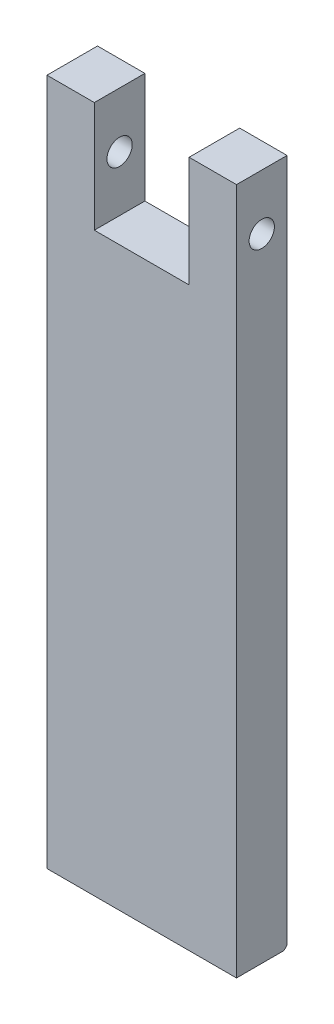
ISO-10303-21;
HEADER;
FILE_DESCRIPTION(('STEP AP214'),'2;1');
FILE_NAME('part.step','',(''),(''),'','','');
FILE_SCHEMA(('AUTOMOTIVE_DESIGN { 1 0 10303 214 1 1 1 1 }'));
ENDSEC;
DATA;
#1=APPLICATION_CONTEXT('core data for automotive mechanical design processes');
#2=APPLICATION_PROTOCOL_DEFINITION('international standard','automotive_design',2000,#1);
#3=PRODUCT_CONTEXT('',#1,'mechanical');
#4=PRODUCT('Part','Part','',(#3));
#5=PRODUCT_RELATED_PRODUCT_CATEGORY('part','',(#4));
#6=PRODUCT_DEFINITION_FORMATION('','',#4);
#7=PRODUCT_DEFINITION_CONTEXT('part definition',#1,'design');
#8=PRODUCT_DEFINITION('design','',#6,#7);
#9=PRODUCT_DEFINITION_SHAPE('','',#8);
#10=(LENGTH_UNIT() NAMED_UNIT(*) SI_UNIT(.MILLI.,.METRE.));
#11=(NAMED_UNIT(*) PLANE_ANGLE_UNIT() SI_UNIT($,.RADIAN.));
#12=(NAMED_UNIT(*) SI_UNIT($,.STERADIAN.) SOLID_ANGLE_UNIT());
#13=UNCERTAINTY_MEASURE_WITH_UNIT(LENGTH_MEASURE(1.E-05),#10,'distance_accuracy_value','');
#14=(GEOMETRIC_REPRESENTATION_CONTEXT(3) GLOBAL_UNCERTAINTY_ASSIGNED_CONTEXT((#13)) GLOBAL_UNIT_ASSIGNED_CONTEXT((#10,
#11,#12)) REPRESENTATION_CONTEXT('',''));
#15=CARTESIAN_POINT('',(0.,0.,0.));
#16=DIRECTION('',(0.,0.,1.));
#17=DIRECTION('',(1.,0.,0.));
#18=AXIS2_PLACEMENT_3D('',#15,#16,#17);
#19=CARTESIAN_POINT('',(0.,0.,16.));
#20=DIRECTION('',(1.,0.,0.));
#21=DIRECTION('',(0.,0.,-1.));
#22=AXIS2_PLACEMENT_3D('',#19,#20,#21);
#23=PLANE('',#22);
#24=CARTESIAN_POINT('',(0.,200.,8.));
#25=DIRECTION('',(-1.,0.,0.));
#26=DIRECTION('',(0.,0.,1.));
#27=AXIS2_PLACEMENT_3D('',#24,#25,#26);
#28=CIRCLE('',#27,4.);
#29=CARTESIAN_POINT('',(0.,200.,12.));
#30=VERTEX_POINT('',#29);
#31=EDGE_CURVE('E232',#30,#30,#28,.T.);
#32=ORIENTED_EDGE('',*,*,#31,.F.);
#33=EDGE_LOOP('',(#32));
#34=FACE_BOUND('',#33,.T.);
#35=DIRECTION('',(0.,-1.,0.));
#36=VECTOR('',#35,1.);
#37=CARTESIAN_POINT('',(0.,0.,16.));
#38=LINE('',#37,#36);
#39=CARTESIAN_POINT('',(0.,217.5,16.));
#40=VERTEX_POINT('',#39);
#41=CARTESIAN_POINT('',(0.,0.,16.));
#42=VERTEX_POINT('',#41);
#43=EDGE_CURVE('E137',#40,#42,#38,.T.);
#44=ORIENTED_EDGE('',*,*,#43,.F.);
#45=DIRECTION('',(0.,0.,-1.));
#46=VECTOR('',#45,1.);
#47=CARTESIAN_POINT('',(0.,217.5,16.));
#48=LINE('',#47,#46);
#49=CARTESIAN_POINT('',(0.,217.5,0.));
#50=VERTEX_POINT('',#49);
#51=EDGE_CURVE('E127',#40,#50,#48,.T.);
#52=ORIENTED_EDGE('',*,*,#51,.T.);
#53=DIRECTION('',(0.,-1.,0.));
#54=VECTOR('',#53,1.);
#55=CARTESIAN_POINT('',(0.,0.,0.));
#56=LINE('',#55,#54);
#57=CARTESIAN_POINT('',(0.,1.,0.));
#58=VERTEX_POINT('',#57);
#59=EDGE_CURVE('E141',#50,#58,#56,.T.);
#60=ORIENTED_EDGE('',*,*,#59,.T.);
#61=DIRECTION('',(0.,-0.707106781186548,0.707106781186548));
#62=VECTOR('',#61,1.);
#63=CARTESIAN_POINT('',(0.,0.,1.));
#64=LINE('',#63,#62);
#65=CARTESIAN_POINT('',(0.,0.,1.));
#66=VERTEX_POINT('',#65);
#67=EDGE_CURVE('E12',#58,#66,#64,.T.);
#68=ORIENTED_EDGE('',*,*,#67,.T.);
#69=DIRECTION('',(0.,0.,-1.));
#70=VECTOR('',#69,1.);
#71=CARTESIAN_POINT('',(0.,0.,16.));
#72=LINE('',#71,#70);
#73=EDGE_CURVE('E135',#42,#66,#72,.T.);
#74=ORIENTED_EDGE('',*,*,#73,.F.);
#75=EDGE_LOOP('',(#44,#52,#60,#68,#74));
#76=FACE_BOUND('',#75,.T.);
#77=ADVANCED_FACE('F35',(#34,#76),#23,.F.);
#78=CARTESIAN_POINT('',(0.,0.,16.));
#79=DIRECTION('',(0.,1.,0.));
#80=DIRECTION('',(0.,0.,1.));
#81=AXIS2_PLACEMENT_3D('',#78,#79,#80);
#82=PLANE('',#81);
#83=CARTESIAN_POINT('',(41.5,0.,8.5));
#84=DIRECTION('',(0.,-1.,0.));
#85=DIRECTION('',(0.,0.,-1.));
#86=AXIS2_PLACEMENT_3D('',#83,#84,#85);
#87=CIRCLE('',#86,2.);
#88=CARTESIAN_POINT('',(41.5,0.,6.5));
#89=VERTEX_POINT('',#88);
#90=EDGE_CURVE('E264',#89,#89,#87,.T.);
#91=ORIENTED_EDGE('',*,*,#90,.F.);
#92=EDGE_LOOP('',(#91));
#93=FACE_BOUND('',#92,.T.);
#94=CARTESIAN_POINT('',(18.5,0.,8.5));
#95=DIRECTION('',(0.,-1.,0.));
#96=DIRECTION('',(0.,0.,-1.));
#97=AXIS2_PLACEMENT_3D('',#94,#95,#96);
#98=CIRCLE('',#97,2.);
#99=CARTESIAN_POINT('',(18.5,0.,6.5));
#100=VERTEX_POINT('',#99);
#101=EDGE_CURVE('E267',#100,#100,#98,.T.);
#102=ORIENTED_EDGE('',*,*,#101,.F.);
#103=EDGE_LOOP('',(#102));
#104=FACE_BOUND('',#103,.T.);
#105=ORIENTED_EDGE('',*,*,#73,.T.);
#106=DIRECTION('',(1.,0.,0.));
#107=VECTOR('',#106,1.);
#108=CARTESIAN_POINT('',(60.,0.,1.));
#109=LINE('',#108,#107);
#110=CARTESIAN_POINT('',(60.,0.,1.));
#111=VERTEX_POINT('',#110);
#112=EDGE_CURVE('E147',#66,#111,#109,.T.);
#113=ORIENTED_EDGE('',*,*,#112,.T.);
#114=DIRECTION('',(0.,0.,-1.));
#115=VECTOR('',#114,1.);
#116=CARTESIAN_POINT('',(60.,0.,16.));
#117=LINE('',#116,#115);
#118=CARTESIAN_POINT('',(60.,0.,16.));
#119=VERTEX_POINT('',#118);
#120=EDGE_CURVE('E133',#119,#111,#117,.T.);
#121=ORIENTED_EDGE('',*,*,#120,.F.);
#122=DIRECTION('',(1.,0.,0.));
#123=VECTOR('',#122,1.);
#124=CARTESIAN_POINT('',(0.,0.,16.));
#125=LINE('',#124,#123);
#126=EDGE_CURVE('E131',#42,#119,#125,.T.);
#127=ORIENTED_EDGE('',*,*,#126,.F.);
#128=EDGE_LOOP('',(#105,#113,#121,#127));
#129=FACE_BOUND('',#128,.T.);
#130=ADVANCED_FACE('F166',(#93,#104,#129),#82,.F.);
#131=CARTESIAN_POINT('',(60.,0.,16.));
#132=DIRECTION('',(-1.,0.,0.));
#133=DIRECTION('',(0.,0.,1.));
#134=AXIS2_PLACEMENT_3D('',#131,#132,#133);
#135=PLANE('',#134);
#136=CARTESIAN_POINT('',(60.,200.,8.));
#137=DIRECTION('',(-1.,0.,0.));
#138=DIRECTION('',(0.,0.,1.));
#139=AXIS2_PLACEMENT_3D('',#136,#137,#138);
#140=CIRCLE('',#139,4.);
#141=CARTESIAN_POINT('',(60.,200.,12.));
#142=VERTEX_POINT('',#141);
#143=EDGE_CURVE('E235',#142,#142,#140,.T.);
#144=ORIENTED_EDGE('',*,*,#143,.T.);
#145=EDGE_LOOP('',(#144));
#146=FACE_BOUND('',#145,.T.);
#147=DIRECTION('',(0.,1.,0.));
#148=VECTOR('',#147,1.);
#149=CARTESIAN_POINT('',(60.,0.,0.));
#150=LINE('',#149,#148);
#151=CARTESIAN_POINT('',(60.,1.,0.));
#152=VERTEX_POINT('',#151);
#153=CARTESIAN_POINT('',(60.,217.5,0.));
#154=VERTEX_POINT('',#153);
#155=EDGE_CURVE('E126',#152,#154,#150,.T.);
#156=ORIENTED_EDGE('',*,*,#155,.T.);
#157=DIRECTION('',(0.,0.,-1.));
#158=VECTOR('',#157,1.);
#159=CARTESIAN_POINT('',(60.,217.5,16.));
#160=LINE('',#159,#158);
#161=CARTESIAN_POINT('',(60.,217.5,16.));
#162=VERTEX_POINT('',#161);
#163=EDGE_CURVE('E110',#162,#154,#160,.T.);
#164=ORIENTED_EDGE('',*,*,#163,.F.);
#165=DIRECTION('',(0.,1.,0.));
#166=VECTOR('',#165,1.);
#167=CARTESIAN_POINT('',(60.,0.,16.));
#168=LINE('',#167,#166);
#169=EDGE_CURVE('E124',#119,#162,#168,.T.);
#170=ORIENTED_EDGE('',*,*,#169,.F.);
#171=ORIENTED_EDGE('',*,*,#120,.T.);
#172=DIRECTION('',(0.,0.707106781186548,-0.707106781186548));
#173=VECTOR('',#172,1.);
#174=CARTESIAN_POINT('',(60.,0.,1.));
#175=LINE('',#174,#173);
#176=EDGE_CURVE('E150',#111,#152,#175,.T.);
#177=ORIENTED_EDGE('',*,*,#176,.T.);
#178=EDGE_LOOP('',(#156,#164,#170,#171,#177));
#179=FACE_BOUND('',#178,.T.);
#180=ADVANCED_FACE('F122',(#146,#179),#135,.F.);
#181=CARTESIAN_POINT('',(0.,0.,16.));
#182=DIRECTION('',(0.,0.,-1.));
#183=DIRECTION('',(-1.,0.,0.));
#184=AXIS2_PLACEMENT_3D('',#181,#182,#183);
#185=PLANE('',#184);
#186=ORIENTED_EDGE('',*,*,#169,.T.);
#187=DIRECTION('',(-1.,0.,0.));
#188=VECTOR('',#187,1.);
#189=CARTESIAN_POINT('',(0.,217.5,16.));
#190=LINE('',#189,#188);
#191=CARTESIAN_POINT('',(45.,217.5,16.));
#192=VERTEX_POINT('',#191);
#193=EDGE_CURVE('E107',#162,#192,#190,.T.);
#194=ORIENTED_EDGE('',*,*,#193,.T.);
#195=DIRECTION('',(0.,1.,0.));
#196=VECTOR('',#195,1.);
#197=CARTESIAN_POINT('',(45.,182.5,16.));
#198=LINE('',#197,#196);
#199=CARTESIAN_POINT('',(45.,182.5,16.));
#200=VERTEX_POINT('',#199);
#201=EDGE_CURVE('E244',#200,#192,#198,.T.);
#202=ORIENTED_EDGE('',*,*,#201,.F.);
#203=DIRECTION('',(1.,0.,0.));
#204=VECTOR('',#203,1.);
#205=CARTESIAN_POINT('',(15.,182.5,16.));
#206=LINE('',#205,#204);
#207=CARTESIAN_POINT('',(15.,182.5,16.));
#208=VERTEX_POINT('',#207);
#209=EDGE_CURVE('E254',#208,#200,#206,.T.);
#210=ORIENTED_EDGE('',*,*,#209,.F.);
#211=DIRECTION('',(0.,-1.,0.));
#212=VECTOR('',#211,1.);
#213=CARTESIAN_POINT('',(15.,182.5,16.));
#214=LINE('',#213,#212);
#215=CARTESIAN_POINT('',(15.,217.5,16.));
#216=VERTEX_POINT('',#215);
#217=EDGE_CURVE('E51',#216,#208,#214,.T.);
#218=ORIENTED_EDGE('',*,*,#217,.F.);
#219=EDGE_CURVE('E117',#216,#40,#190,.T.);
#220=ORIENTED_EDGE('',*,*,#219,.T.);
#221=ORIENTED_EDGE('',*,*,#43,.T.);
#222=ORIENTED_EDGE('',*,*,#126,.T.);
#223=EDGE_LOOP('',(#186,#194,#202,#210,#218,#220,#221,#222));
#224=FACE_BOUND('',#223,.T.);
#225=ADVANCED_FACE('F129',(#224),#185,.F.);
#226=CARTESIAN_POINT('',(0.,0.,0.));
#227=DIRECTION('',(0.,0.,-1.));
#228=DIRECTION('',(-1.,0.,0.));
#229=AXIS2_PLACEMENT_3D('',#226,#227,#228);
#230=PLANE('',#229);
#231=DIRECTION('',(-1.,0.,0.));
#232=VECTOR('',#231,1.);
#233=CARTESIAN_POINT('',(0.,217.5,0.));
#234=LINE('',#233,#232);
#235=CARTESIAN_POINT('',(45.,217.5,0.));
#236=VERTEX_POINT('',#235);
#237=EDGE_CURVE('E230',#154,#236,#234,.T.);
#238=ORIENTED_EDGE('',*,*,#237,.F.);
#239=ORIENTED_EDGE('',*,*,#155,.F.);
#240=DIRECTION('',(-1.,0.,0.));
#241=VECTOR('',#240,1.);
#242=CARTESIAN_POINT('',(0.,1.,0.));
#243=LINE('',#242,#241);
#244=EDGE_CURVE('E44',#152,#58,#243,.T.);
#245=ORIENTED_EDGE('',*,*,#244,.T.);
#246=ORIENTED_EDGE('',*,*,#59,.F.);
#247=CARTESIAN_POINT('',(15.,217.5,0.));
#248=VERTEX_POINT('',#247);
#249=EDGE_CURVE('E225',#248,#50,#234,.T.);
#250=ORIENTED_EDGE('',*,*,#249,.F.);
#251=DIRECTION('',(0.,1.,0.));
#252=VECTOR('',#251,1.);
#253=CARTESIAN_POINT('',(15.,182.5,0.));
#254=LINE('',#253,#252);
#255=CARTESIAN_POINT('',(15.,182.5,0.));
#256=VERTEX_POINT('',#255);
#257=EDGE_CURVE('E250',#256,#248,#254,.T.);
#258=ORIENTED_EDGE('',*,*,#257,.F.);
#259=DIRECTION('',(-1.,0.,0.));
#260=VECTOR('',#259,1.);
#261=CARTESIAN_POINT('',(15.,182.5,0.));
#262=LINE('',#261,#260);
#263=CARTESIAN_POINT('',(45.,182.5,0.));
#264=VERTEX_POINT('',#263);
#265=EDGE_CURVE('E247',#264,#256,#262,.T.);
#266=ORIENTED_EDGE('',*,*,#265,.F.);
#267=DIRECTION('',(0.,-1.,0.));
#268=VECTOR('',#267,1.);
#269=CARTESIAN_POINT('',(45.,182.5,0.));
#270=LINE('',#269,#268);
#271=EDGE_CURVE('E59',#236,#264,#270,.T.);
#272=ORIENTED_EDGE('',*,*,#271,.F.);
#273=EDGE_LOOP('',(#238,#239,#245,#246,#250,#258,#266,#272));
#274=FACE_BOUND('',#273,.T.);
#275=ADVANCED_FACE('F157',(#274),#230,.T.);
#276=CARTESIAN_POINT('',(0.,0.,1.));
#277=DIRECTION('',(0.,-0.707106781186547,-0.707106781186547));
#278=DIRECTION('',(-1.,0.,0.));
#279=AXIS2_PLACEMENT_3D('',#276,#277,#278);
#280=PLANE('',#279);
#281=ORIENTED_EDGE('',*,*,#67,.F.);
#282=ORIENTED_EDGE('',*,*,#244,.F.);
#283=ORIENTED_EDGE('',*,*,#176,.F.);
#284=ORIENTED_EDGE('',*,*,#112,.F.);
#285=EDGE_LOOP('',(#281,#282,#283,#284));
#286=FACE_BOUND('',#285,.T.);
#287=ADVANCED_FACE('F37',(#286),#280,.T.);
#288=CARTESIAN_POINT('',(18.5,15.,8.5));
#289=DIRECTION('',(0.,-1.,0.));
#290=DIRECTION('',(0.,0.,-1.));
#291=AXIS2_PLACEMENT_3D('',#288,#289,#290);
#292=CYLINDRICAL_SURFACE('',#291,2.);
#293=CARTESIAN_POINT('',(18.5,15.,8.5));
#294=DIRECTION('',(0.,-1.,0.));
#295=DIRECTION('',(0.,0.,-1.));
#296=AXIS2_PLACEMENT_3D('',#293,#294,#295);
#297=CIRCLE('',#296,2.);
#298=CARTESIAN_POINT('',(18.5,15.,6.5));
#299=VERTEX_POINT('',#298);
#300=EDGE_CURVE('E261',#299,#299,#297,.T.);
#301=ORIENTED_EDGE('',*,*,#300,.F.);
#302=EDGE_LOOP('',(#301));
#303=FACE_BOUND('',#302,.T.);
#304=ORIENTED_EDGE('',*,*,#101,.T.);
#305=EDGE_LOOP('',(#304));
#306=FACE_BOUND('',#305,.T.);
#307=ADVANCED_FACE('F188',(#303,#306),#292,.F.);
#308=CARTESIAN_POINT('',(18.5,15.,8.5));
#309=DIRECTION('',(0.,-1.,0.));
#310=DIRECTION('',(0.,0.,-1.));
#311=AXIS2_PLACEMENT_3D('',#308,#309,#310);
#312=PLANE('',#311);
#313=ORIENTED_EDGE('',*,*,#300,.T.);
#314=EDGE_LOOP('',(#313));
#315=FACE_BOUND('',#314,.T.);
#316=ADVANCED_FACE('F184',(#315),#312,.T.);
#317=CARTESIAN_POINT('',(41.5,15.,8.5));
#318=DIRECTION('',(0.,-1.,0.));
#319=DIRECTION('',(0.,0.,-1.));
#320=AXIS2_PLACEMENT_3D('',#317,#318,#319);
#321=CYLINDRICAL_SURFACE('',#320,2.);
#322=CARTESIAN_POINT('',(41.5,15.,8.5));
#323=DIRECTION('',(0.,-1.,0.));
#324=DIRECTION('',(0.,0.,-1.));
#325=AXIS2_PLACEMENT_3D('',#322,#323,#324);
#326=CIRCLE('',#325,2.);
#327=CARTESIAN_POINT('',(41.5,15.,6.5));
#328=VERTEX_POINT('',#327);
#329=EDGE_CURVE('E143',#328,#328,#326,.T.);
#330=ORIENTED_EDGE('',*,*,#329,.F.);
#331=EDGE_LOOP('',(#330));
#332=FACE_BOUND('',#331,.T.);
#333=ORIENTED_EDGE('',*,*,#90,.T.);
#334=EDGE_LOOP('',(#333));
#335=FACE_BOUND('',#334,.T.);
#336=ADVANCED_FACE('F187',(#332,#335),#321,.F.);
#337=CARTESIAN_POINT('',(41.5,15.,8.5));
#338=DIRECTION('',(0.,-1.,0.));
#339=DIRECTION('',(0.,0.,-1.));
#340=AXIS2_PLACEMENT_3D('',#337,#338,#339);
#341=PLANE('',#340);
#342=ORIENTED_EDGE('',*,*,#329,.T.);
#343=EDGE_LOOP('',(#342));
#344=FACE_BOUND('',#343,.T.);
#345=ADVANCED_FACE('F195',(#344),#341,.T.);
#346=CARTESIAN_POINT('',(45.,182.5,16.001));
#347=DIRECTION('',(1.,0.,0.));
#348=DIRECTION('',(0.,0.,-1.));
#349=AXIS2_PLACEMENT_3D('',#346,#347,#348);
#350=PLANE('',#349);
#351=CARTESIAN_POINT('',(45.,200.,8.));
#352=DIRECTION('',(1.,0.,0.));
#353=DIRECTION('',(0.,0.,-1.));
#354=AXIS2_PLACEMENT_3D('',#351,#352,#353);
#355=CIRCLE('',#354,4.);
#356=CARTESIAN_POINT('',(45.,200.,4.));
#357=VERTEX_POINT('',#356);
#358=EDGE_CURVE('E240',#357,#357,#355,.T.);
#359=ORIENTED_EDGE('',*,*,#358,.T.);
#360=EDGE_LOOP('',(#359));
#361=FACE_BOUND('',#360,.T.);
#362=ORIENTED_EDGE('',*,*,#201,.T.);
#363=DIRECTION('',(0.,0.,-1.));
#364=VECTOR('',#363,1.);
#365=CARTESIAN_POINT('',(45.,217.5,16.001));
#366=LINE('',#365,#364);
#367=EDGE_CURVE('E112',#192,#236,#366,.T.);
#368=ORIENTED_EDGE('',*,*,#367,.T.);
#369=ORIENTED_EDGE('',*,*,#271,.T.);
#370=DIRECTION('',(0.,0.,-1.));
#371=VECTOR('',#370,1.);
#372=CARTESIAN_POINT('',(45.,182.5,16.001));
#373=LINE('',#372,#371);
#374=EDGE_CURVE('E252',#200,#264,#373,.T.);
#375=ORIENTED_EDGE('',*,*,#374,.F.);
#376=EDGE_LOOP('',(#362,#368,#369,#375));
#377=FACE_BOUND('',#376,.T.);
#378=ADVANCED_FACE('F199',(#361,#377),#350,.F.);
#379=CARTESIAN_POINT('',(15.,182.5,16.001));
#380=DIRECTION('',(-1.,0.,0.));
#381=DIRECTION('',(0.,0.,1.));
#382=AXIS2_PLACEMENT_3D('',#379,#380,#381);
#383=PLANE('',#382);
#384=CARTESIAN_POINT('',(15.,200.,8.));
#385=DIRECTION('',(-1.,0.,0.));
#386=DIRECTION('',(0.,0.,1.));
#387=AXIS2_PLACEMENT_3D('',#384,#385,#386);
#388=CIRCLE('',#387,4.);
#389=CARTESIAN_POINT('',(15.,200.,12.));
#390=VERTEX_POINT('',#389);
#391=EDGE_CURVE('E39',#390,#390,#388,.T.);
#392=ORIENTED_EDGE('',*,*,#391,.T.);
#393=EDGE_LOOP('',(#392));
#394=FACE_BOUND('',#393,.T.);
#395=ORIENTED_EDGE('',*,*,#217,.T.);
#396=DIRECTION('',(0.,0.,-1.));
#397=VECTOR('',#396,1.);
#398=CARTESIAN_POINT('',(15.,182.5,16.001));
#399=LINE('',#398,#397);
#400=EDGE_CURVE('E256',#208,#256,#399,.T.);
#401=ORIENTED_EDGE('',*,*,#400,.T.);
#402=ORIENTED_EDGE('',*,*,#257,.T.);
#403=DIRECTION('',(0.,0.,-1.));
#404=VECTOR('',#403,1.);
#405=CARTESIAN_POINT('',(15.,217.5,16.001));
#406=LINE('',#405,#404);
#407=EDGE_CURVE('E227',#216,#248,#406,.T.);
#408=ORIENTED_EDGE('',*,*,#407,.F.);
#409=EDGE_LOOP('',(#395,#401,#402,#408));
#410=FACE_BOUND('',#409,.T.);
#411=ADVANCED_FACE('F203',(#394,#410),#383,.F.);
#412=CARTESIAN_POINT('',(15.,182.5,16.001));
#413=DIRECTION('',(0.,-1.,0.));
#414=DIRECTION('',(0.,0.,-1.));
#415=AXIS2_PLACEMENT_3D('',#412,#413,#414);
#416=PLANE('',#415);
#417=ORIENTED_EDGE('',*,*,#209,.T.);
#418=ORIENTED_EDGE('',*,*,#374,.T.);
#419=ORIENTED_EDGE('',*,*,#265,.T.);
#420=ORIENTED_EDGE('',*,*,#400,.F.);
#421=EDGE_LOOP('',(#417,#418,#419,#420));
#422=FACE_BOUND('',#421,.T.);
#423=ADVANCED_FACE('F205',(#422),#416,.F.);
#424=CARTESIAN_POINT('',(60.,200.,8.));
#425=DIRECTION('',(-1.,0.,0.));
#426=DIRECTION('',(0.,0.,1.));
#427=AXIS2_PLACEMENT_3D('',#424,#425,#426);
#428=CYLINDRICAL_SURFACE('',#427,4.);
#429=ORIENTED_EDGE('',*,*,#31,.T.);
#430=EDGE_LOOP('',(#429));
#431=FACE_BOUND('',#430,.T.);
#432=ORIENTED_EDGE('',*,*,#391,.F.);
#433=EDGE_LOOP('',(#432));
#434=FACE_BOUND('',#433,.T.);
#435=ADVANCED_FACE('F208',(#431,#434),#428,.F.);
#436=ORIENTED_EDGE('',*,*,#143,.F.);
#437=EDGE_LOOP('',(#436));
#438=FACE_BOUND('',#437,.T.);
#439=ORIENTED_EDGE('',*,*,#358,.F.);
#440=EDGE_LOOP('',(#439));
#441=FACE_BOUND('',#440,.T.);
#442=ADVANCED_FACE('F213',(#438,#441),#428,.F.);
#443=CARTESIAN_POINT('',(0.,217.5,16.));
#444=DIRECTION('',(0.,-1.,0.));
#445=DIRECTION('',(0.,0.,-1.));
#446=AXIS2_PLACEMENT_3D('',#443,#444,#445);
#447=PLANE('',#446);
#448=ORIENTED_EDGE('',*,*,#249,.T.);
#449=ORIENTED_EDGE('',*,*,#51,.F.);
#450=ORIENTED_EDGE('',*,*,#219,.F.);
#451=ORIENTED_EDGE('',*,*,#407,.T.);
#452=EDGE_LOOP('',(#448,#449,#450,#451));
#453=FACE_BOUND('',#452,.T.);
#454=ADVANCED_FACE('F216',(#453),#447,.F.);
#455=ORIENTED_EDGE('',*,*,#193,.F.);
#456=ORIENTED_EDGE('',*,*,#163,.T.);
#457=ORIENTED_EDGE('',*,*,#237,.T.);
#458=ORIENTED_EDGE('',*,*,#367,.F.);
#459=EDGE_LOOP('',(#455,#456,#457,#458));
#460=FACE_BOUND('',#459,.T.);
#461=ADVANCED_FACE('F109',(#460),#447,.F.);
#462=CLOSED_SHELL('',(#77,#130,#180,#225,#275,#287,#307,#316,#336,#345,#378,#411,#423,#435,#442,
#454,#461));
#463=MANIFOLD_SOLID_BREP('B2',#462);
#464=ADVANCED_BREP_SHAPE_REPRESENTATION('',(#18,#463),#14);
#465=SHAPE_DEFINITION_REPRESENTATION(#9,#464);
ENDSEC;
END-ISO-10303-21;
